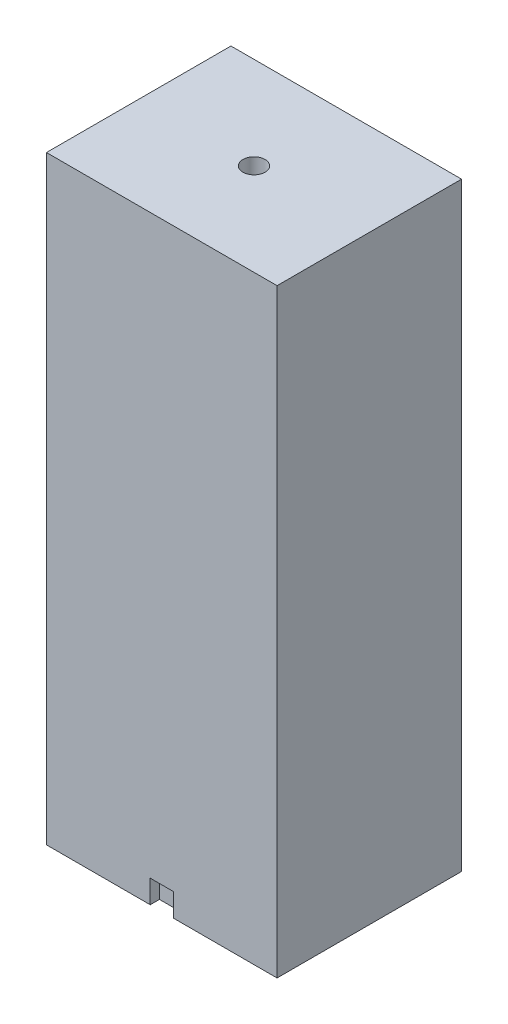
ISO-10303-21;
HEADER;
FILE_DESCRIPTION(('STEP AP214'),'2;1');
FILE_NAME('part.step','',(''),(''),'','','');
FILE_SCHEMA(('AUTOMOTIVE_DESIGN { 1 0 10303 214 1 1 1 1 }'));
ENDSEC;
DATA;
#1=APPLICATION_CONTEXT('core data for automotive mechanical design processes');
#2=APPLICATION_PROTOCOL_DEFINITION('international standard','automotive_design',2000,#1);
#3=PRODUCT_CONTEXT('',#1,'mechanical');
#4=PRODUCT('Part','Part','',(#3));
#5=PRODUCT_RELATED_PRODUCT_CATEGORY('part','',(#4));
#6=PRODUCT_DEFINITION_FORMATION('','',#4);
#7=PRODUCT_DEFINITION_CONTEXT('part definition',#1,'design');
#8=PRODUCT_DEFINITION('design','',#6,#7);
#9=PRODUCT_DEFINITION_SHAPE('','',#8);
#10=(LENGTH_UNIT() NAMED_UNIT(*) SI_UNIT(.MILLI.,.METRE.));
#11=(NAMED_UNIT(*) PLANE_ANGLE_UNIT() SI_UNIT($,.RADIAN.));
#12=(NAMED_UNIT(*) SI_UNIT($,.STERADIAN.) SOLID_ANGLE_UNIT());
#13=UNCERTAINTY_MEASURE_WITH_UNIT(LENGTH_MEASURE(1.E-05),#10,'distance_accuracy_value','');
#14=(GEOMETRIC_REPRESENTATION_CONTEXT(3) GLOBAL_UNCERTAINTY_ASSIGNED_CONTEXT((#13)) GLOBAL_UNIT_ASSIGNED_CONTEXT((#10,
#11,#12)) REPRESENTATION_CONTEXT('',''));
#15=CARTESIAN_POINT('',(0.,0.,0.));
#16=DIRECTION('',(0.,0.,1.));
#17=DIRECTION('',(1.,0.,0.));
#18=AXIS2_PLACEMENT_3D('',#15,#16,#17);
#19=CARTESIAN_POINT('',(0.,0.,50.8));
#20=DIRECTION('',(1.,0.,0.));
#21=DIRECTION('',(0.,0.,-1.));
#22=AXIS2_PLACEMENT_3D('',#19,#20,#21);
#23=PLANE('',#22);
#24=DIRECTION('',(0.,-1.,0.));
#25=VECTOR('',#24,1.);
#26=CARTESIAN_POINT('',(0.,0.,0.));
#27=LINE('',#26,#25);
#28=CARTESIAN_POINT('',(0.,165.1,0.));
#29=VERTEX_POINT('',#28);
#30=CARTESIAN_POINT('',(0.,0.,0.));
#31=VERTEX_POINT('',#30);
#32=EDGE_CURVE('E151',#29,#31,#27,.T.);
#33=ORIENTED_EDGE('',*,*,#32,.T.);
#34=DIRECTION('',(0.,0.,-1.));
#35=VECTOR('',#34,1.);
#36=CARTESIAN_POINT('',(0.,0.,50.8));
#37=LINE('',#36,#35);
#38=CARTESIAN_POINT('',(0.,0.,50.8));
#39=VERTEX_POINT('',#38);
#40=EDGE_CURVE('E40',#39,#31,#37,.T.);
#41=ORIENTED_EDGE('',*,*,#40,.F.);
#42=DIRECTION('',(0.,-1.,0.));
#43=VECTOR('',#42,1.);
#44=CARTESIAN_POINT('',(0.,0.,50.8));
#45=LINE('',#44,#43);
#46=CARTESIAN_POINT('',(0.,165.1,50.8));
#47=VERTEX_POINT('',#46);
#48=EDGE_CURVE('E152',#47,#39,#45,.T.);
#49=ORIENTED_EDGE('',*,*,#48,.F.);
#50=DIRECTION('',(0.,0.,-1.));
#51=VECTOR('',#50,1.);
#52=CARTESIAN_POINT('',(0.,165.1,50.8));
#53=LINE('',#52,#51);
#54=EDGE_CURVE('E159',#47,#29,#53,.T.);
#55=ORIENTED_EDGE('',*,*,#54,.T.);
#56=EDGE_LOOP('',(#33,#41,#49,#55));
#57=FACE_BOUND('',#56,.T.);
#58=ADVANCED_FACE('F33',(#57),#23,.F.);
#59=CARTESIAN_POINT('',(0.,0.,50.8));
#60=DIRECTION('',(0.,1.,0.));
#61=DIRECTION('',(0.,0.,1.));
#62=AXIS2_PLACEMENT_3D('',#59,#60,#61);
#63=PLANE('',#62);
#64=DIRECTION('',(1.,0.,0.));
#65=VECTOR('',#64,1.);
#66=CARTESIAN_POINT('',(0.,0.,50.8));
#67=LINE('',#66,#65);
#68=CARTESIAN_POINT('',(34.925,0.,50.8));
#69=VERTEX_POINT('',#68);
#70=CARTESIAN_POINT('',(63.5,0.,50.8));
#71=VERTEX_POINT('',#70);
#72=EDGE_CURVE('E154',#69,#71,#67,.T.);
#73=ORIENTED_EDGE('',*,*,#72,.F.);
#74=DIRECTION('',(0.,0.,1.));
#75=VECTOR('',#74,1.);
#76=CARTESIAN_POINT('',(34.925,0.,48.26));
#77=LINE('',#76,#75);
#78=CARTESIAN_POINT('',(34.925,0.,48.26));
#79=VERTEX_POINT('',#78);
#80=EDGE_CURVE('E137',#79,#69,#77,.T.);
#81=ORIENTED_EDGE('',*,*,#80,.F.);
#82=DIRECTION('',(1.,0.,0.));
#83=VECTOR('',#82,1.);
#84=CARTESIAN_POINT('',(34.925,0.,48.26));
#85=LINE('',#84,#83);
#86=CARTESIAN_POINT('',(28.575,0.,48.26));
#87=VERTEX_POINT('',#86);
#88=EDGE_CURVE('E115',#87,#79,#85,.T.);
#89=ORIENTED_EDGE('',*,*,#88,.F.);
#90=DIRECTION('',(0.,0.,1.));
#91=VECTOR('',#90,1.);
#92=CARTESIAN_POINT('',(28.575,0.,48.26));
#93=LINE('',#92,#91);
#94=CARTESIAN_POINT('',(28.575,0.,50.8));
#95=VERTEX_POINT('',#94);
#96=EDGE_CURVE('E140',#87,#95,#93,.T.);
#97=ORIENTED_EDGE('',*,*,#96,.T.);
#98=EDGE_CURVE('E85',#39,#95,#67,.T.);
#99=ORIENTED_EDGE('',*,*,#98,.F.);
#100=ORIENTED_EDGE('',*,*,#40,.T.);
#101=DIRECTION('',(1.,0.,0.));
#102=VECTOR('',#101,1.);
#103=CARTESIAN_POINT('',(0.,0.,0.));
#104=LINE('',#103,#102);
#105=CARTESIAN_POINT('',(63.5,0.,0.));
#106=VERTEX_POINT('',#105);
#107=EDGE_CURVE('E162',#31,#106,#104,.T.);
#108=ORIENTED_EDGE('',*,*,#107,.T.);
#109=DIRECTION('',(0.,0.,-1.));
#110=VECTOR('',#109,1.);
#111=CARTESIAN_POINT('',(63.5,0.,50.8));
#112=LINE('',#111,#110);
#113=EDGE_CURVE('E170',#71,#106,#112,.T.);
#114=ORIENTED_EDGE('',*,*,#113,.F.);
#115=EDGE_LOOP('',(#73,#81,#89,#97,#99,#100,#108,#114));
#116=FACE_BOUND('',#115,.T.);
#117=CARTESIAN_POINT('',(31.75,0.,25.4));
#118=DIRECTION('',(0.,1.,0.));
#119=DIRECTION('',(0.,0.,1.));
#120=AXIS2_PLACEMENT_3D('',#117,#118,#119);
#121=CIRCLE('',#120,3.048);
#122=CARTESIAN_POINT('',(31.75,0.,28.448));
#123=VERTEX_POINT('',#122);
#124=EDGE_CURVE('E11',#123,#123,#121,.F.);
#125=ORIENTED_EDGE('',*,*,#124,.F.);
#126=EDGE_LOOP('',(#125));
#127=FACE_BOUND('',#126,.T.);
#128=ADVANCED_FACE('F174',(#116,#127),#63,.F.);
#129=CARTESIAN_POINT('',(63.5,0.,50.8));
#130=DIRECTION('',(-1.,0.,0.));
#131=DIRECTION('',(0.,0.,1.));
#132=AXIS2_PLACEMENT_3D('',#129,#130,#131);
#133=PLANE('',#132);
#134=DIRECTION('',(0.,1.,0.));
#135=VECTOR('',#134,1.);
#136=CARTESIAN_POINT('',(63.5,0.,0.));
#137=LINE('',#136,#135);
#138=CARTESIAN_POINT('',(63.5,165.1,0.));
#139=VERTEX_POINT('',#138);
#140=EDGE_CURVE('E164',#106,#139,#137,.T.);
#141=ORIENTED_EDGE('',*,*,#140,.T.);
#142=DIRECTION('',(0.,0.,-1.));
#143=VECTOR('',#142,1.);
#144=CARTESIAN_POINT('',(63.5,165.1,50.8));
#145=LINE('',#144,#143);
#146=CARTESIAN_POINT('',(63.5,165.1,50.8));
#147=VERTEX_POINT('',#146);
#148=EDGE_CURVE('E168',#147,#139,#145,.T.);
#149=ORIENTED_EDGE('',*,*,#148,.F.);
#150=DIRECTION('',(0.,1.,0.));
#151=VECTOR('',#150,1.);
#152=CARTESIAN_POINT('',(63.5,0.,50.8));
#153=LINE('',#152,#151);
#154=EDGE_CURVE('E156',#71,#147,#153,.T.);
#155=ORIENTED_EDGE('',*,*,#154,.F.);
#156=ORIENTED_EDGE('',*,*,#113,.T.);
#157=EDGE_LOOP('',(#141,#149,#155,#156));
#158=FACE_BOUND('',#157,.T.);
#159=ADVANCED_FACE('F185',(#158),#133,.F.);
#160=CARTESIAN_POINT('',(0.,165.1,50.8));
#161=DIRECTION('',(0.,-1.,0.));
#162=DIRECTION('',(0.,0.,-1.));
#163=AXIS2_PLACEMENT_3D('',#160,#161,#162);
#164=PLANE('',#163);
#165=CARTESIAN_POINT('',(31.75,165.1,25.4));
#166=DIRECTION('',(0.,1.,0.));
#167=DIRECTION('',(0.,0.,1.));
#168=AXIS2_PLACEMENT_3D('',#165,#166,#167);
#169=CIRCLE('',#168,3.048);
#170=CARTESIAN_POINT('',(31.75,165.1,28.448));
#171=VERTEX_POINT('',#170);
#172=EDGE_CURVE('E139',#171,#171,#169,.T.);
#173=ORIENTED_EDGE('',*,*,#172,.F.);
#174=EDGE_LOOP('',(#173));
#175=FACE_BOUND('',#174,.T.);
#176=DIRECTION('',(-1.,0.,0.));
#177=VECTOR('',#176,1.);
#178=CARTESIAN_POINT('',(0.,165.1,0.));
#179=LINE('',#178,#177);
#180=EDGE_CURVE('E77',#139,#29,#179,.T.);
#181=ORIENTED_EDGE('',*,*,#180,.T.);
#182=ORIENTED_EDGE('',*,*,#54,.F.);
#183=DIRECTION('',(-1.,0.,0.));
#184=VECTOR('',#183,1.);
#185=CARTESIAN_POINT('',(0.,165.1,50.8));
#186=LINE('',#185,#184);
#187=EDGE_CURVE('E56',#147,#47,#186,.T.);
#188=ORIENTED_EDGE('',*,*,#187,.F.);
#189=ORIENTED_EDGE('',*,*,#148,.T.);
#190=EDGE_LOOP('',(#181,#182,#188,#189));
#191=FACE_BOUND('',#190,.T.);
#192=ADVANCED_FACE('F187',(#175,#191),#164,.F.);
#193=CARTESIAN_POINT('',(0.,0.,50.8));
#194=DIRECTION('',(0.,0.,-1.));
#195=DIRECTION('',(-1.,0.,0.));
#196=AXIS2_PLACEMENT_3D('',#193,#194,#195);
#197=PLANE('',#196);
#198=DIRECTION('',(-1.,0.,0.));
#199=VECTOR('',#198,1.);
#200=CARTESIAN_POINT('',(34.925,6.35,50.8));
#201=LINE('',#200,#199);
#202=CARTESIAN_POINT('',(34.925,6.35,50.8));
#203=VERTEX_POINT('',#202);
#204=CARTESIAN_POINT('',(28.575,6.35,50.8));
#205=VERTEX_POINT('',#204);
#206=EDGE_CURVE('E130',#203,#205,#201,.T.);
#207=ORIENTED_EDGE('',*,*,#206,.F.);
#208=DIRECTION('',(0.,1.,0.));
#209=VECTOR('',#208,1.);
#210=CARTESIAN_POINT('',(34.925,0.,50.8));
#211=LINE('',#210,#209);
#212=EDGE_CURVE('E47',#69,#203,#211,.T.);
#213=ORIENTED_EDGE('',*,*,#212,.F.);
#214=ORIENTED_EDGE('',*,*,#72,.T.);
#215=ORIENTED_EDGE('',*,*,#154,.T.);
#216=ORIENTED_EDGE('',*,*,#187,.T.);
#217=ORIENTED_EDGE('',*,*,#48,.T.);
#218=ORIENTED_EDGE('',*,*,#98,.T.);
#219=DIRECTION('',(0.,-1.,0.));
#220=VECTOR('',#219,1.);
#221=CARTESIAN_POINT('',(28.575,0.,50.8));
#222=LINE('',#221,#220);
#223=EDGE_CURVE('E128',#205,#95,#222,.T.);
#224=ORIENTED_EDGE('',*,*,#223,.F.);
#225=EDGE_LOOP('',(#207,#213,#214,#215,#216,#217,#218,#224));
#226=FACE_BOUND('',#225,.T.);
#227=ADVANCED_FACE('F188',(#226),#197,.F.);
#228=CARTESIAN_POINT('',(0.,0.,0.));
#229=DIRECTION('',(0.,0.,-1.));
#230=DIRECTION('',(-1.,0.,0.));
#231=AXIS2_PLACEMENT_3D('',#228,#229,#230);
#232=PLANE('',#231);
#233=ORIENTED_EDGE('',*,*,#32,.F.);
#234=ORIENTED_EDGE('',*,*,#180,.F.);
#235=ORIENTED_EDGE('',*,*,#140,.F.);
#236=ORIENTED_EDGE('',*,*,#107,.F.);
#237=EDGE_LOOP('',(#233,#234,#235,#236));
#238=FACE_BOUND('',#237,.T.);
#239=ADVANCED_FACE('F181',(#238),#232,.T.);
#240=CARTESIAN_POINT('',(31.75,-5.08,25.4));
#241=DIRECTION('',(0.,1.,0.));
#242=DIRECTION('',(0.,0.,1.));
#243=AXIS2_PLACEMENT_3D('',#240,#241,#242);
#244=CYLINDRICAL_SURFACE('',#243,3.048);
#245=CARTESIAN_POINT('',(31.75,-5.08,25.4));
#246=DIRECTION('',(0.,-1.,0.));
#247=DIRECTION('',(0.,0.,-1.));
#248=AXIS2_PLACEMENT_3D('',#245,#246,#247);
#249=CIRCLE('',#248,3.048);
#250=CARTESIAN_POINT('',(31.75,-5.08,22.352));
#251=VERTEX_POINT('',#250);
#252=EDGE_CURVE('E146',#251,#251,#249,.T.);
#253=ORIENTED_EDGE('',*,*,#252,.F.);
#254=EDGE_LOOP('',(#253));
#255=FACE_BOUND('',#254,.T.);
#256=ORIENTED_EDGE('',*,*,#124,.T.);
#257=EDGE_LOOP('',(#256));
#258=FACE_BOUND('',#257,.T.);
#259=ADVANCED_FACE('F216',(#255,#258),#244,.T.);
#260=CARTESIAN_POINT('',(31.75,-5.08,25.4));
#261=DIRECTION('',(0.,-1.,0.));
#262=DIRECTION('',(0.,0.,-1.));
#263=AXIS2_PLACEMENT_3D('',#260,#261,#262);
#264=PLANE('',#263);
#265=ORIENTED_EDGE('',*,*,#252,.T.);
#266=EDGE_LOOP('',(#265));
#267=FACE_BOUND('',#266,.T.);
#268=ADVANCED_FACE('F221',(#267),#264,.T.);
#269=CARTESIAN_POINT('',(31.75,158.75,25.4));
#270=DIRECTION('',(0.,1.,0.));
#271=DIRECTION('',(0.,0.,1.));
#272=AXIS2_PLACEMENT_3D('',#269,#270,#271);
#273=CYLINDRICAL_SURFACE('',#272,3.048);
#274=CARTESIAN_POINT('',(31.75,158.75,25.4));
#275=DIRECTION('',(0.,1.,0.));
#276=DIRECTION('',(0.,0.,1.));
#277=AXIS2_PLACEMENT_3D('',#274,#275,#276);
#278=CIRCLE('',#277,3.048);
#279=CARTESIAN_POINT('',(31.75,158.75,28.448));
#280=VERTEX_POINT('',#279);
#281=EDGE_CURVE('E143',#280,#280,#278,.T.);
#282=ORIENTED_EDGE('',*,*,#281,.F.);
#283=EDGE_LOOP('',(#282));
#284=FACE_BOUND('',#283,.T.);
#285=ORIENTED_EDGE('',*,*,#172,.T.);
#286=EDGE_LOOP('',(#285));
#287=FACE_BOUND('',#286,.T.);
#288=ADVANCED_FACE('F225',(#284,#287),#273,.F.);
#289=CARTESIAN_POINT('',(31.75,158.75,25.4));
#290=DIRECTION('',(0.,1.,0.));
#291=DIRECTION('',(0.,0.,1.));
#292=AXIS2_PLACEMENT_3D('',#289,#290,#291);
#293=PLANE('',#292);
#294=ORIENTED_EDGE('',*,*,#281,.T.);
#295=EDGE_LOOP('',(#294));
#296=FACE_BOUND('',#295,.T.);
#297=ADVANCED_FACE('F199',(#296),#293,.T.);
#298=CARTESIAN_POINT('',(34.925,0.,48.26));
#299=DIRECTION('',(1.,0.,0.));
#300=DIRECTION('',(0.,1.,0.));
#301=AXIS2_PLACEMENT_3D('',#298,#299,#300);
#302=PLANE('',#301);
#303=ORIENTED_EDGE('',*,*,#212,.T.);
#304=DIRECTION('',(0.,0.,1.));
#305=VECTOR('',#304,1.);
#306=CARTESIAN_POINT('',(34.925,6.35,48.26));
#307=LINE('',#306,#305);
#308=CARTESIAN_POINT('',(34.925,6.35,48.26));
#309=VERTEX_POINT('',#308);
#310=EDGE_CURVE('E105',#309,#203,#307,.T.);
#311=ORIENTED_EDGE('',*,*,#310,.F.);
#312=DIRECTION('',(0.,1.,0.));
#313=VECTOR('',#312,1.);
#314=CARTESIAN_POINT('',(34.925,0.,48.26));
#315=LINE('',#314,#313);
#316=EDGE_CURVE('E109',#79,#309,#315,.T.);
#317=ORIENTED_EDGE('',*,*,#316,.F.);
#318=ORIENTED_EDGE('',*,*,#80,.T.);
#319=EDGE_LOOP('',(#303,#311,#317,#318));
#320=FACE_BOUND('',#319,.T.);
#321=ADVANCED_FACE('F107',(#320),#302,.F.);
#322=CARTESIAN_POINT('',(28.575,0.,48.26));
#323=DIRECTION('',(-1.,0.,0.));
#324=DIRECTION('',(0.,-1.,0.));
#325=AXIS2_PLACEMENT_3D('',#322,#323,#324);
#326=PLANE('',#325);
#327=ORIENTED_EDGE('',*,*,#223,.T.);
#328=ORIENTED_EDGE('',*,*,#96,.F.);
#329=DIRECTION('',(0.,-1.,0.));
#330=VECTOR('',#329,1.);
#331=CARTESIAN_POINT('',(28.575,0.,48.26));
#332=LINE('',#331,#330);
#333=CARTESIAN_POINT('',(28.575,6.35,48.26));
#334=VERTEX_POINT('',#333);
#335=EDGE_CURVE('E123',#334,#87,#332,.T.);
#336=ORIENTED_EDGE('',*,*,#335,.F.);
#337=DIRECTION('',(0.,0.,1.));
#338=VECTOR('',#337,1.);
#339=CARTESIAN_POINT('',(28.575,6.35,48.26));
#340=LINE('',#339,#338);
#341=EDGE_CURVE('E114',#334,#205,#340,.T.);
#342=ORIENTED_EDGE('',*,*,#341,.T.);
#343=EDGE_LOOP('',(#327,#328,#336,#342));
#344=FACE_BOUND('',#343,.T.);
#345=ADVANCED_FACE('F191',(#344),#326,.F.);
#346=CARTESIAN_POINT('',(34.925,6.35,48.26));
#347=DIRECTION('',(0.,1.,0.));
#348=DIRECTION('',(-1.,0.,0.));
#349=AXIS2_PLACEMENT_3D('',#346,#347,#348);
#350=PLANE('',#349);
#351=ORIENTED_EDGE('',*,*,#206,.T.);
#352=ORIENTED_EDGE('',*,*,#341,.F.);
#353=DIRECTION('',(-1.,0.,0.));
#354=VECTOR('',#353,1.);
#355=CARTESIAN_POINT('',(34.925,6.35,48.26));
#356=LINE('',#355,#354);
#357=EDGE_CURVE('E118',#309,#334,#356,.T.);
#358=ORIENTED_EDGE('',*,*,#357,.F.);
#359=ORIENTED_EDGE('',*,*,#310,.T.);
#360=EDGE_LOOP('',(#351,#352,#358,#359));
#361=FACE_BOUND('',#360,.T.);
#362=ADVANCED_FACE('F119',(#361),#350,.F.);
#363=CARTESIAN_POINT('',(0.,0.,48.26));
#364=DIRECTION('',(0.,0.,1.));
#365=DIRECTION('',(1.,0.,0.));
#366=AXIS2_PLACEMENT_3D('',#363,#364,#365);
#367=PLANE('',#366);
#368=ORIENTED_EDGE('',*,*,#316,.T.);
#369=ORIENTED_EDGE('',*,*,#357,.T.);
#370=ORIENTED_EDGE('',*,*,#335,.T.);
#371=ORIENTED_EDGE('',*,*,#88,.T.);
#372=EDGE_LOOP('',(#368,#369,#370,#371));
#373=FACE_BOUND('',#372,.T.);
#374=ADVANCED_FACE('F125',(#373),#367,.T.);
#375=CLOSED_SHELL('',(#58,#128,#159,#192,#227,#239,#259,#268,#288,#297,#321,#345,#362,#374));
#376=MANIFOLD_SOLID_BREP('B2',#375);
#377=ADVANCED_BREP_SHAPE_REPRESENTATION('',(#18,#376),#14);
#378=SHAPE_DEFINITION_REPRESENTATION(#9,#377);
ENDSEC;
END-ISO-10303-21;
